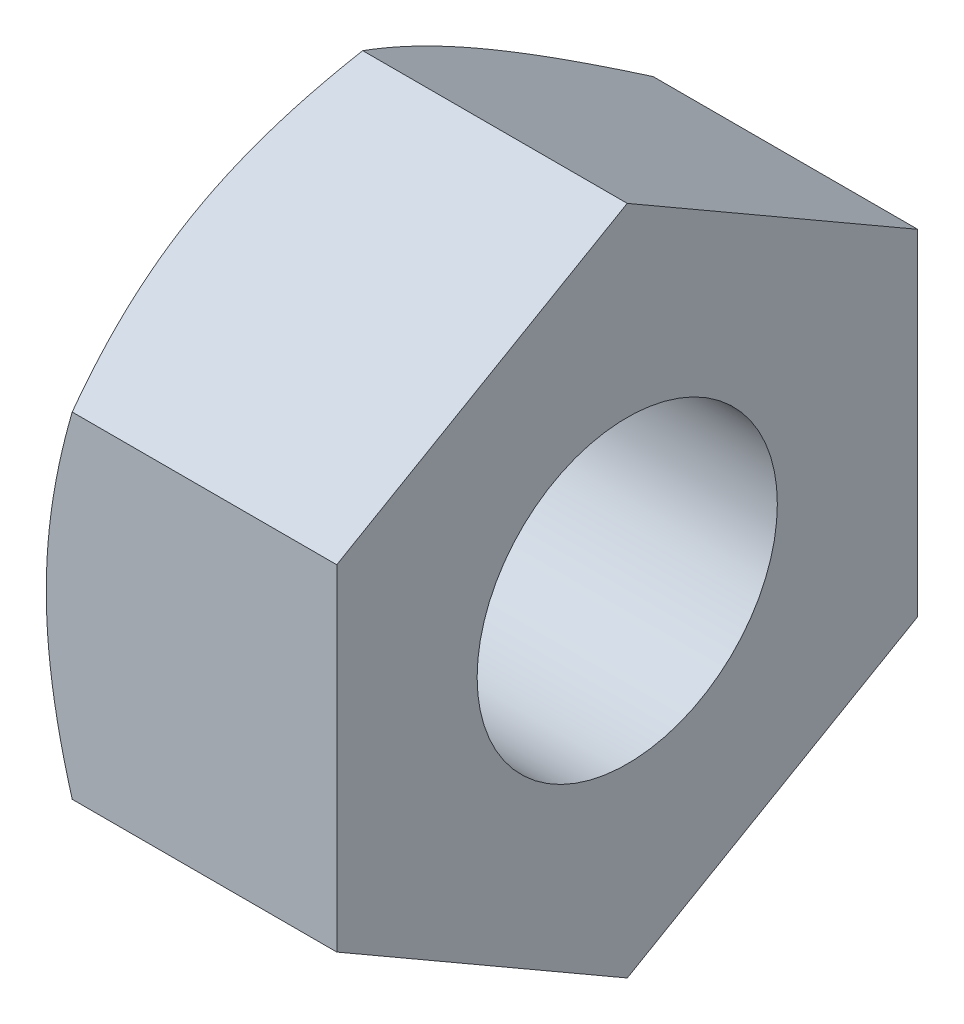
ISO-10303-21;
HEADER;
FILE_DESCRIPTION(('STEP AP214'),'2;1');
FILE_NAME('part.step','',(''),(''),'','','');
FILE_SCHEMA(('AUTOMOTIVE_DESIGN { 1 0 10303 214 1 1 1 1 }'));
ENDSEC;
DATA;
#1=APPLICATION_CONTEXT('core data for automotive mechanical design processes');
#2=APPLICATION_PROTOCOL_DEFINITION('international standard','automotive_design',2000,#1);
#3=PRODUCT_CONTEXT('',#1,'mechanical');
#4=PRODUCT('Part','Part','',(#3));
#5=PRODUCT_RELATED_PRODUCT_CATEGORY('part','',(#4));
#6=PRODUCT_DEFINITION_FORMATION('','',#4);
#7=PRODUCT_DEFINITION_CONTEXT('part definition',#1,'design');
#8=PRODUCT_DEFINITION('design','',#6,#7);
#9=PRODUCT_DEFINITION_SHAPE('','',#8);
#10=(LENGTH_UNIT() NAMED_UNIT(*) SI_UNIT(.MILLI.,.METRE.));
#11=(NAMED_UNIT(*) PLANE_ANGLE_UNIT() SI_UNIT($,.RADIAN.));
#12=(NAMED_UNIT(*) SI_UNIT($,.STERADIAN.) SOLID_ANGLE_UNIT());
#13=UNCERTAINTY_MEASURE_WITH_UNIT(LENGTH_MEASURE(1.E-05),#10,'distance_accuracy_value','');
#14=(GEOMETRIC_REPRESENTATION_CONTEXT(3) GLOBAL_UNCERTAINTY_ASSIGNED_CONTEXT((#13)) GLOBAL_UNIT_ASSIGNED_CONTEXT((#10,
#11,#12)) REPRESENTATION_CONTEXT('',''));
#15=CARTESIAN_POINT('',(0.,0.,0.));
#16=DIRECTION('',(0.,0.,1.));
#17=DIRECTION('',(1.,0.,0.));
#18=AXIS2_PLACEMENT_3D('',#15,#16,#17);
#19=CARTESIAN_POINT('',(-4.,0.,0.));
#20=DIRECTION('',(1.,0.,0.));
#21=DIRECTION('',(0.,0.,-1.));
#22=AXIS2_PLACEMENT_3D('',#19,#20,#21);
#23=PLANE('',#22);
#24=CARTESIAN_POINT('',(-4.,0.,0.));
#25=DIRECTION('',(1.,0.,0.));
#26=DIRECTION('',(0.,0.,-1.));
#27=AXIS2_PLACEMENT_3D('',#24,#25,#26);
#28=CIRCLE('',#27,4.);
#29=CARTESIAN_POINT('',(-4.,0.,-4.));
#30=VERTEX_POINT('',#29);
#31=CARTESIAN_POINT('',(-4.,3.46410161513775,-2.));
#32=VERTEX_POINT('',#31);
#33=EDGE_CURVE('E11',#30,#32,#28,.T.);
#34=ORIENTED_EDGE('',*,*,#33,.F.);
#35=CARTESIAN_POINT('',(-4.,-3.46410161513775,-2.));
#36=VERTEX_POINT('',#35);
#37=EDGE_CURVE('E52',#36,#30,#28,.T.);
#38=ORIENTED_EDGE('',*,*,#37,.F.);
#39=CARTESIAN_POINT('',(-4.,-3.46410161513775,2.));
#40=VERTEX_POINT('',#39);
#41=EDGE_CURVE('E284',#40,#36,#28,.T.);
#42=ORIENTED_EDGE('',*,*,#41,.F.);
#43=CARTESIAN_POINT('',(-4.,0.,4.));
#44=VERTEX_POINT('',#43);
#45=EDGE_CURVE('E285',#44,#40,#28,.T.);
#46=ORIENTED_EDGE('',*,*,#45,.F.);
#47=CARTESIAN_POINT('',(-4.,0.,0.));
#48=DIRECTION('',(-1.,0.,0.));
#49=DIRECTION('',(0.,0.,1.));
#50=AXIS2_PLACEMENT_3D('',#47,#48,#49);
#51=CIRCLE('',#50,4.);
#52=CARTESIAN_POINT('',(-4.,3.46410161513776,2.));
#53=VERTEX_POINT('',#52);
#54=EDGE_CURVE('E257',#44,#53,#51,.T.);
#55=ORIENTED_EDGE('',*,*,#54,.T.);
#56=EDGE_CURVE('E57',#32,#53,#28,.T.);
#57=ORIENTED_EDGE('',*,*,#56,.F.);
#58=EDGE_LOOP('',(#34,#38,#42,#46,#55,#57));
#59=FACE_BOUND('',#58,.T.);
#60=CARTESIAN_POINT('',(-4.,0.,0.));
#61=DIRECTION('',(-1.,0.,0.));
#62=DIRECTION('',(0.,0.,1.));
#63=AXIS2_PLACEMENT_3D('',#60,#61,#62);
#64=CIRCLE('',#63,2.067);
#65=CARTESIAN_POINT('',(-4.,0.,2.067));
#66=VERTEX_POINT('',#65);
#67=EDGE_CURVE('E252',#66,#66,#64,.T.);
#68=ORIENTED_EDGE('',*,*,#67,.F.);
#69=EDGE_LOOP('',(#68));
#70=FACE_BOUND('',#69,.T.);
#71=ADVANCED_FACE('F47',(#59,#70),#23,.F.);
#72=CARTESIAN_POINT('',(-4.,2.30940107675849,-4.));
#73=DIRECTION('',(0.,0.866025403784439,-0.5));
#74=DIRECTION('',(0.,0.5,0.866025403784439));
#75=AXIS2_PLACEMENT_3D('',#72,#73,#74);
#76=PLANE('',#75);
#77=DIRECTION('',(1.,0.,0.));
#78=VECTOR('',#77,1.);
#79=CARTESIAN_POINT('',(-4.,2.30940107675849,-4.));
#80=LINE('',#79,#78);
#81=CARTESIAN_POINT('',(-3.64273441009185,2.30940107675847,-4.));
#82=VERTEX_POINT('',#81);
#83=CARTESIAN_POINT('',(0.,2.30940107675849,-4.));
#84=VERTEX_POINT('',#83);
#85=EDGE_CURVE('E151',#82,#84,#80,.T.);
#86=ORIENTED_EDGE('',*,*,#85,.F.);
#87=CARTESIAN_POINT('',(-3.64266774092524,2.30928560670465,-4.0002));
#88=CARTESIAN_POINT('',(-3.70128212635173,2.41077174646169,-3.82442084967677));
#89=CARTESIAN_POINT('',(-3.75458967853775,2.51313390883498,-3.64712438367362));
#90=CARTESIAN_POINT('',(-3.8476383292536,2.7196307247981,-3.28946140682429));
#91=CARTESIAN_POINT('',(-3.8873465109703,2.82376904741903,-3.10908854102985));
#92=CARTESIAN_POINT('',(-3.94915778471973,3.03075510011793,-2.75057818129721));
#93=CARTESIAN_POINT('',(-3.97167226847712,3.1335709837249,-2.57249584706486));
#94=CARTESIAN_POINT('',(-3.99854937685343,3.33968651028526,-2.2154932828335));
#95=CARTESIAN_POINT('',(-4.00293425857306,3.44298540411432,-2.0365743503559));
#96=CARTESIAN_POINT('',(-3.99380992706004,3.6360035252293,-1.70225715780327));
#97=CARTESIAN_POINT('',(-3.98254104601201,3.72575165335063,-1.54680884001294));
#98=CARTESIAN_POINT('',(-3.94682600920182,3.90466320392053,-1.23692494436495));
#99=CARTESIAN_POINT('',(-3.92236765428848,3.99382600759477,-1.08249043825587));
#100=CARTESIAN_POINT('',(-3.86122393508072,4.17310641015195,-0.771967672225425));
#101=CARTESIAN_POINT('',(-3.82427939634515,4.26320131938129,-0.615918711936901));
#102=CARTESIAN_POINT('',(-3.74042992745199,4.44204742827549,-0.306148164596163));
#103=CARTESIAN_POINT('',(-3.69354469778727,4.53080091904965,-0.152422609226222));
#104=CARTESIAN_POINT('',(-3.64266774092525,4.61891762357083,0.000199999999999194));
#105=B_SPLINE_CURVE_WITH_KNOTS('',3,(#87,#88,#89,#90,#91,#92,#93,#94,#95,#96,#97,#98,#99,#100,
#101,#102,#103,#104),.UNSPECIFIED.,.F.,.F.,(4,2,2,2,2,2,2,2,4),(0.,0.634047835695964,
1.26961969224543,1.88946157213121,2.50854226669296,3.04757825393385,3.58711366126903,
4.13861653143763,4.68903648037743),.UNSPECIFIED.);
#106=EDGE_CURVE('E132',#82,#32,#105,.T.);
#107=ORIENTED_EDGE('',*,*,#106,.T.);
#108=CARTESIAN_POINT('',(-3.64273441009185,4.61880215351699,0.));
#109=VERTEX_POINT('',#108);
#110=EDGE_CURVE('E64',#32,#109,#105,.T.);
#111=ORIENTED_EDGE('',*,*,#110,.T.);
#112=DIRECTION('',(1.,0.,0.));
#113=VECTOR('',#112,1.);
#114=CARTESIAN_POINT('',(-4.,4.61880215351699,0.));
#115=LINE('',#114,#113);
#116=CARTESIAN_POINT('',(0.,4.61880215351699,0.));
#117=VERTEX_POINT('',#116);
#118=EDGE_CURVE('E130',#109,#117,#115,.T.);
#119=ORIENTED_EDGE('',*,*,#118,.T.);
#120=DIRECTION('',(0.,0.5,0.866025403784439));
#121=VECTOR('',#120,1.);
#122=CARTESIAN_POINT('',(0.,2.30940107675849,-4.));
#123=LINE('',#122,#121);
#124=EDGE_CURVE('E162',#84,#117,#123,.T.);
#125=ORIENTED_EDGE('',*,*,#124,.F.);
#126=EDGE_LOOP('',(#86,#107,#111,#119,#125));
#127=FACE_BOUND('',#126,.T.);
#128=ADVANCED_FACE('F49',(#127),#76,.T.);
#129=CARTESIAN_POINT('',(-4.,-2.30940107675852,-4.));
#130=DIRECTION('',(0.,0.,-1.));
#131=DIRECTION('',(-1.,0.,0.));
#132=AXIS2_PLACEMENT_3D('',#129,#130,#131);
#133=PLANE('',#132);
#134=DIRECTION('',(1.,0.,0.));
#135=VECTOR('',#134,1.);
#136=CARTESIAN_POINT('',(-4.,-2.30940107675852,-4.));
#137=LINE('',#136,#135);
#138=CARTESIAN_POINT('',(-3.64273441009185,-2.30940107675855,-3.99999999999996));
#139=VERTEX_POINT('',#138);
#140=CARTESIAN_POINT('',(0.,-2.30940107675852,-4.));
#141=VERTEX_POINT('',#140);
#142=EDGE_CURVE('E149',#139,#141,#137,.T.);
#143=ORIENTED_EDGE('',*,*,#142,.F.);
#144=CARTESIAN_POINT('',(-2.08589317875938,-6.12487198995894,-4.));
#145=CARTESIAN_POINT('',(-2.17076372923312,-5.94924937038678,-4.));
#146=CARTESIAN_POINT('',(-2.25479059619262,-5.77321152095287,-4.));
#147=CARTESIAN_POINT('',(-2.42067485320286,-5.42008084777956,-4.));
#148=CARTESIAN_POINT('',(-2.50253186763279,-5.24298784779929,-4.));
#149=CARTESIAN_POINT('',(-2.66402553694146,-4.88656571686335,-4.));
#150=CARTESIAN_POINT('',(-2.74364680493698,-4.70722958889363,-4.));
#151=CARTESIAN_POINT('',(-2.89946941457972,-4.34708334747264,-4.));
#152=CARTESIAN_POINT('',(-2.97567093449199,-4.16627331143539,-4.));
#153=CARTESIAN_POINT('',(-3.12464934960565,-3.80064706744979,-4.));
#154=CARTESIAN_POINT('',(-3.19737271578416,-3.61580892822771,-4.));
#155=CARTESIAN_POINT('',(-3.33712376904059,-3.2439524679497,-4.));
#156=CARTESIAN_POINT('',(-3.4041508224335,-3.05693390695802,-4.));
#157=CARTESIAN_POINT('',(-3.53070825156912,-2.68080318253772,-4.));
#158=CARTESIAN_POINT('',(-3.59025456521617,-2.4916964371285,-4.));
#159=CARTESIAN_POINT('',(-3.6999166434555,-2.11079454635852,-4.));
#160=CARTESIAN_POINT('',(-3.75003539032325,-1.9190002718575,-4.));
#161=CARTESIAN_POINT('',(-3.83840920504596,-1.53259232698201,-4.));
#162=CARTESIAN_POINT('',(-3.87666111404346,-1.33797792031651,-4.));
#163=CARTESIAN_POINT('',(-3.93872576407766,-0.94640272587257,-4.));
#164=CARTESIAN_POINT('',(-3.9625384923483,-0.74944193601979,-4.));
#165=CARTESIAN_POINT('',(-3.99361818685056,-0.355451989627959,-4.));
#166=CARTESIAN_POINT('',(-4.00098990076104,-0.158431311094028,-4.));
#167=CARTESIAN_POINT('',(-3.99879593362521,0.235472085607451,-4.));
#168=CARTESIAN_POINT('',(-3.98923464918465,0.432354826312188,-4.));
#169=CARTESIAN_POINT('',(-3.95912126538641,0.768560635225502,-4.));
#170=CARTESIAN_POINT('',(-3.94249070395609,0.908254618381807,-4.));
#171=CARTESIAN_POINT('',(-3.90178658965331,1.18656349063496,-4.));
#172=CARTESIAN_POINT('',(-3.87771186294156,1.32517820601013,-4.));
#173=CARTESIAN_POINT('',(-3.79558492904977,1.73929045452969,-4.));
#174=CARTESIAN_POINT('',(-3.72765111357485,2.01284690528723,-4.));
#175=CARTESIAN_POINT('',(-3.6104836406828,2.42218253014525,-4.));
#176=CARTESIAN_POINT('',(-3.56828605818837,2.5600953636154,-4.));
#177=CARTESIAN_POINT('',(-3.47971541977224,2.83448159101406,-4.));
#178=CARTESIAN_POINT('',(-3.43334524381309,2.9709559062356,-4.));
#179=CARTESIAN_POINT('',(-3.33739430081971,3.24189440516344,-4.));
#180=CARTESIAN_POINT('',(-3.2878330742465,3.37636557946841,-4.));
#181=CARTESIAN_POINT('',(-3.1858016462093,3.64426461152917,-4.));
#182=CARTESIAN_POINT('',(-3.13333026903663,3.77769202239391,-4.));
#183=CARTESIAN_POINT('',(-3.07969099345821,3.91063698986688,-4.));
#184=B_SPLINE_CURVE_WITH_KNOTS('',3,(#144,#145,#146,#147,#148,#149,#150,#151,#152,#153,#154,
#155,#156,#157,#158,#159,#160,#161,#162,#163,#164,#165,#166,#167,#168,#169,#170,#171,#172,#173,
#174,#175,#176,#177,#178,#179,#180,#181,#182,#183),.UNSPECIFIED.,.F.,.F.,(4,2,2,2,2,2,2,2,2,2,2,
2,2,2,2,2,2,2,2,4),(0.,0.585171792532271,1.17044423059927,1.7590659464599,2.34765694284827,
2.94347400997483,3.53935727210689,4.133948646976,4.7283516139147,5.32291267067844,
5.91747425310812,6.50823685854036,7.09884609659885,7.52068140825521,7.9425832713084,
8.78701491359831,9.21965281897692,9.651994371163,10.0819024146297,10.5119854255247),.UNSPECIFIED.);
#185=EDGE_CURVE('E271',#139,#30,#184,.T.);
#186=ORIENTED_EDGE('',*,*,#185,.T.);
#187=EDGE_CURVE('E175',#30,#82,#184,.T.);
#188=ORIENTED_EDGE('',*,*,#187,.T.);
#189=ORIENTED_EDGE('',*,*,#85,.T.);
#190=DIRECTION('',(0.,1.,0.));
#191=VECTOR('',#190,1.);
#192=CARTESIAN_POINT('',(0.,-2.30940107675852,-4.));
#193=LINE('',#192,#191);
#194=EDGE_CURVE('E139',#141,#84,#193,.T.);
#195=ORIENTED_EDGE('',*,*,#194,.F.);
#196=EDGE_LOOP('',(#143,#186,#188,#189,#195));
#197=FACE_BOUND('',#196,.T.);
#198=ADVANCED_FACE('F245',(#197),#133,.T.);
#199=CARTESIAN_POINT('',(-4.,-4.61880215351703,0.));
#200=DIRECTION('',(0.,-0.866025403784439,-0.5));
#201=DIRECTION('',(0.,0.5,-0.866025403784439));
#202=AXIS2_PLACEMENT_3D('',#199,#200,#201);
#203=PLANE('',#202);
#204=DIRECTION('',(1.,0.,0.));
#205=VECTOR('',#204,1.);
#206=CARTESIAN_POINT('',(-4.,-4.61880215351703,0.));
#207=LINE('',#206,#205);
#208=CARTESIAN_POINT('',(-3.64273441009185,-4.61880215351699,0.));
#209=VERTEX_POINT('',#208);
#210=CARTESIAN_POINT('',(0.,-4.61880215351703,0.));
#211=VERTEX_POINT('',#210);
#212=EDGE_CURVE('E147',#209,#211,#207,.T.);
#213=ORIENTED_EDGE('',*,*,#212,.F.);
#214=CARTESIAN_POINT('',(-3.64266774092523,-4.61891762357086,0.00020000000000064));
#215=CARTESIAN_POINT('',(-3.70128212635171,-4.51743148381382,-0.175579150323228));
#216=CARTESIAN_POINT('',(-3.75458967853773,-4.41506932144053,-0.352875616326382));
#217=CARTESIAN_POINT('',(-3.84763832925359,-4.20857250547741,-0.710538593175708));
#218=CARTESIAN_POINT('',(-3.88734651097029,-4.10443418285648,-0.890911458970153));
#219=CARTESIAN_POINT('',(-3.94915778471971,-3.89744813015758,-1.24942181870279));
#220=CARTESIAN_POINT('',(-3.9716722684771,-3.79463224655061,-1.42750415293515));
#221=CARTESIAN_POINT('',(-3.99854937685341,-3.58851671999024,-1.78450671716651));
#222=CARTESIAN_POINT('',(-4.00293425857305,-3.48521782616119,-1.96342564964411));
#223=CARTESIAN_POINT('',(-3.99380992706002,-3.2921997050462,-2.29774284219674));
#224=CARTESIAN_POINT('',(-3.982541046012,-3.20245157692488,-2.45319115998707));
#225=CARTESIAN_POINT('',(-3.9468260092018,-3.02354002635498,-2.76307505563506));
#226=CARTESIAN_POINT('',(-3.92236765428846,-2.93437722268074,-2.91750956174413));
#227=CARTESIAN_POINT('',(-3.86122393508071,-2.75509682012356,-3.22803232777458));
#228=CARTESIAN_POINT('',(-3.82427939634513,-2.66500191089422,-3.3840812880631));
#229=CARTESIAN_POINT('',(-3.74042992745197,-2.48615580200003,-3.69385183540384));
#230=CARTESIAN_POINT('',(-3.69354469778726,-2.39740231122587,-3.84757739077378));
#231=CARTESIAN_POINT('',(-3.64266774092523,-2.30928560670469,-4.0002));
#232=B_SPLINE_CURVE_WITH_KNOTS('',3,(#214,#215,#216,#217,#218,#219,#220,#221,#222,#223,#224,
#225,#226,#227,#228,#229,#230,#231),.UNSPECIFIED.,.F.,.F.,(4,2,2,2,2,2,2,2,4),(0.,
0.634047835695968,1.26961969224544,1.88946157213123,2.50854226669298,3.04757825393386,
3.58711366126904,4.13861653143764,4.68903648037743),.UNSPECIFIED.);
#233=EDGE_CURVE('E164',#209,#36,#232,.T.);
#234=ORIENTED_EDGE('',*,*,#233,.T.);
#235=EDGE_CURVE('E165',#36,#139,#232,.T.);
#236=ORIENTED_EDGE('',*,*,#235,.T.);
#237=ORIENTED_EDGE('',*,*,#142,.T.);
#238=DIRECTION('',(0.,0.5,-0.866025403784439));
#239=VECTOR('',#238,1.);
#240=CARTESIAN_POINT('',(0.,-4.61880215351703,0.));
#241=LINE('',#240,#239);
#242=EDGE_CURVE('E143',#211,#141,#241,.T.);
#243=ORIENTED_EDGE('',*,*,#242,.F.);
#244=EDGE_LOOP('',(#213,#234,#236,#237,#243));
#245=FACE_BOUND('',#244,.T.);
#246=ADVANCED_FACE('F182',(#245),#203,.T.);
#247=CARTESIAN_POINT('',(-4.,-2.30940107675852,4.));
#248=DIRECTION('',(0.,-0.866025403784439,0.5));
#249=DIRECTION('',(0.,-0.5,-0.866025403784438));
#250=AXIS2_PLACEMENT_3D('',#247,#248,#249);
#251=PLANE('',#250);
#252=DIRECTION('',(1.,0.,0.));
#253=VECTOR('',#252,1.);
#254=CARTESIAN_POINT('',(-4.,-2.30940107675852,4.));
#255=LINE('',#254,#253);
#256=CARTESIAN_POINT('',(-3.64273441009185,-2.30940107675847,4.));
#257=VERTEX_POINT('',#256);
#258=CARTESIAN_POINT('',(0.,-2.30940107675852,4.));
#259=VERTEX_POINT('',#258);
#260=EDGE_CURVE('E140',#257,#259,#255,.T.);
#261=ORIENTED_EDGE('',*,*,#260,.F.);
#262=CARTESIAN_POINT('',(-3.64266774092523,-2.30928560670468,4.0002));
#263=CARTESIAN_POINT('',(-3.70128212635172,-2.41077174646172,3.82442084967677));
#264=CARTESIAN_POINT('',(-3.75458967853774,-2.51313390883501,3.64712438367362));
#265=CARTESIAN_POINT('',(-3.84763832925359,-2.71963072479813,3.28946140682429));
#266=CARTESIAN_POINT('',(-3.88734651097029,-2.82376904741906,3.10908854102985));
#267=CARTESIAN_POINT('',(-3.94915778471971,-3.03075510011797,2.75057818129721));
#268=CARTESIAN_POINT('',(-3.9716722684771,-3.13357098372494,2.57249584706486));
#269=CARTESIAN_POINT('',(-3.99854937685341,-3.3396865102853,2.21549328283349));
#270=CARTESIAN_POINT('',(-4.00293425857305,-3.44298540411436,2.0365743503559));
#271=CARTESIAN_POINT('',(-3.99380992706002,-3.63600352522934,1.70225715780327));
#272=CARTESIAN_POINT('',(-3.982541046012,-3.72575165335066,1.54680884001293));
#273=CARTESIAN_POINT('',(-3.9468260092018,-3.90466320392056,1.23692494436494));
#274=CARTESIAN_POINT('',(-3.92236765428846,-3.9938260075948,1.08249043825587));
#275=CARTESIAN_POINT('',(-3.8612239350807,-4.17310641015199,0.771967672225422));
#276=CARTESIAN_POINT('',(-3.82427939634513,-4.26320131938133,0.615918711936898));
#277=CARTESIAN_POINT('',(-3.74042992745197,-4.44204742827552,0.306148164596161));
#278=CARTESIAN_POINT('',(-3.69354469778725,-4.53080091904968,0.152422609226221));
#279=CARTESIAN_POINT('',(-3.64266774092523,-4.61891762357086,-0.000199999999999433));
#280=B_SPLINE_CURVE_WITH_KNOTS('',3,(#262,#263,#264,#265,#266,#267,#268,#269,#270,#271,#272,
#273,#274,#275,#276,#277,#278,#279),.UNSPECIFIED.,.F.,.F.,(4,2,2,2,2,2,2,2,4),(0.,
0.634047835695966,1.26961969224543,1.88946157213122,2.50854226669297,3.04757825393386,
3.58711366126903,4.13861653143764,4.68903648037743),.UNSPECIFIED.);
#281=EDGE_CURVE('E214',#257,#40,#280,.T.);
#282=ORIENTED_EDGE('',*,*,#281,.T.);
#283=EDGE_CURVE('E174',#40,#209,#280,.T.);
#284=ORIENTED_EDGE('',*,*,#283,.T.);
#285=ORIENTED_EDGE('',*,*,#212,.T.);
#286=DIRECTION('',(0.,-0.5,-0.866025403784438));
#287=VECTOR('',#286,1.);
#288=CARTESIAN_POINT('',(0.,-2.30940107675852,4.));
#289=LINE('',#288,#287);
#290=EDGE_CURVE('E155',#259,#211,#289,.T.);
#291=ORIENTED_EDGE('',*,*,#290,.F.);
#292=EDGE_LOOP('',(#261,#282,#284,#285,#291));
#293=FACE_BOUND('',#292,.T.);
#294=ADVANCED_FACE('F221',(#293),#251,.T.);
#295=CARTESIAN_POINT('',(-4.,2.30940107675849,4.));
#296=DIRECTION('',(0.,0.,1.));
#297=DIRECTION('',(1.,0.,0.));
#298=AXIS2_PLACEMENT_3D('',#295,#296,#297);
#299=PLANE('',#298);
#300=DIRECTION('',(1.,0.,0.));
#301=VECTOR('',#300,1.);
#302=CARTESIAN_POINT('',(-4.,2.30940107675849,4.));
#303=LINE('',#302,#301);
#304=CARTESIAN_POINT('',(-3.64273441009185,2.30940107675849,4.));
#305=VERTEX_POINT('',#304);
#306=CARTESIAN_POINT('',(0.,2.30940107675849,4.));
#307=VERTEX_POINT('',#306);
#308=EDGE_CURVE('E138',#305,#307,#303,.T.);
#309=ORIENTED_EDGE('',*,*,#308,.F.);
#310=CARTESIAN_POINT('',(-2.08589317875938,-6.12487198995894,4.));
#311=CARTESIAN_POINT('',(-2.17076372923312,-5.94924937038678,4.));
#312=CARTESIAN_POINT('',(-2.25479059619262,-5.77321152095287,4.));
#313=CARTESIAN_POINT('',(-2.42067485320286,-5.42008084777956,4.));
#314=CARTESIAN_POINT('',(-2.50253186763279,-5.24298784779929,4.));
#315=CARTESIAN_POINT('',(-2.66402553694146,-4.88656571686335,4.));
#316=CARTESIAN_POINT('',(-2.74364680493698,-4.70722958889363,4.));
#317=CARTESIAN_POINT('',(-2.89946941457972,-4.34708334747264,4.));
#318=CARTESIAN_POINT('',(-2.97567093449199,-4.16627331143539,4.));
#319=CARTESIAN_POINT('',(-3.12464934960565,-3.80064706744979,4.));
#320=CARTESIAN_POINT('',(-3.19737271578416,-3.61580892822771,4.));
#321=CARTESIAN_POINT('',(-3.33712376904059,-3.24395246794969,4.));
#322=CARTESIAN_POINT('',(-3.4041508224335,-3.05693390695802,4.));
#323=CARTESIAN_POINT('',(-3.53070825156912,-2.68080318253772,4.));
#324=CARTESIAN_POINT('',(-3.59025456521617,-2.4916964371285,4.));
#325=CARTESIAN_POINT('',(-3.6999166434555,-2.11079454635852,4.));
#326=CARTESIAN_POINT('',(-3.75003539032325,-1.9190002718575,4.));
#327=CARTESIAN_POINT('',(-3.83840920504596,-1.53259232698201,4.));
#328=CARTESIAN_POINT('',(-3.87666111404346,-1.33797792031651,4.));
#329=CARTESIAN_POINT('',(-3.93872576407766,-0.946402725872566,4.));
#330=CARTESIAN_POINT('',(-3.9625384923483,-0.749441936019787,4.));
#331=CARTESIAN_POINT('',(-3.99361818685056,-0.355451989627956,4.));
#332=CARTESIAN_POINT('',(-4.00098990076104,-0.158431311094025,4.));
#333=CARTESIAN_POINT('',(-3.9987959336252,0.235472085607454,4.));
#334=CARTESIAN_POINT('',(-3.98923464918465,0.43235482631219,4.));
#335=CARTESIAN_POINT('',(-3.95912126538641,0.768560635225504,4.));
#336=CARTESIAN_POINT('',(-3.94249070395609,0.908254618381809,4.));
#337=CARTESIAN_POINT('',(-3.90178658965331,1.18656349063497,4.));
#338=CARTESIAN_POINT('',(-3.87771186294156,1.32517820601013,4.));
#339=CARTESIAN_POINT('',(-3.79558492904977,1.7392904545297,4.));
#340=CARTESIAN_POINT('',(-3.72765111357485,2.01284690528723,4.));
#341=CARTESIAN_POINT('',(-3.6104836406828,2.42218253014525,4.));
#342=CARTESIAN_POINT('',(-3.56828605818836,2.5600953636154,4.));
#343=CARTESIAN_POINT('',(-3.47971541977224,2.83448159101406,4.));
#344=CARTESIAN_POINT('',(-3.43334524381309,2.9709559062356,4.));
#345=CARTESIAN_POINT('',(-3.33739430081971,3.24189440516344,4.));
#346=CARTESIAN_POINT('',(-3.2878330742465,3.37636557946842,4.));
#347=CARTESIAN_POINT('',(-3.1858016462093,3.64426461152918,4.));
#348=CARTESIAN_POINT('',(-3.13333026903663,3.77769202239391,4.));
#349=CARTESIAN_POINT('',(-3.0796909934582,3.91063698986689,4.));
#350=B_SPLINE_CURVE_WITH_KNOTS('',3,(#310,#311,#312,#313,#314,#315,#316,#317,#318,#319,#320,
#321,#322,#323,#324,#325,#326,#327,#328,#329,#330,#331,#332,#333,#334,#335,#336,#337,#338,#339,
#340,#341,#342,#343,#344,#345,#346,#347,#348,#349),.UNSPECIFIED.,.F.,.F.,(4,2,2,2,2,2,2,2,2,2,2,
2,2,2,2,2,2,2,2,4),(0.,0.58517179253227,1.17044423059927,1.75906594645989,2.34765694284826,
2.94347400997483,3.53935727210689,4.133948646976,4.7283516139147,5.32291267067844,
5.91747425310812,6.50823685854036,7.09884609659885,7.52068140825521,7.9425832713084,
8.78701491359831,9.21965281897692,9.65199437116301,10.0819024146297,10.5119854255247),.UNSPECIFIED.);
#351=EDGE_CURVE('E124',#305,#44,#350,.F.);
#352=ORIENTED_EDGE('',*,*,#351,.T.);
#353=EDGE_CURVE('E220',#44,#257,#350,.F.);
#354=ORIENTED_EDGE('',*,*,#353,.T.);
#355=ORIENTED_EDGE('',*,*,#260,.T.);
#356=DIRECTION('',(0.,-1.,0.));
#357=VECTOR('',#356,1.);
#358=CARTESIAN_POINT('',(0.,2.30940107675849,4.));
#359=LINE('',#358,#357);
#360=EDGE_CURVE('E158',#307,#259,#359,.T.);
#361=ORIENTED_EDGE('',*,*,#360,.F.);
#362=EDGE_LOOP('',(#309,#352,#354,#355,#361));
#363=FACE_BOUND('',#362,.T.);
#364=ADVANCED_FACE('F224',(#363),#299,.T.);
#365=CARTESIAN_POINT('',(-4.,4.61880215351699,0.));
#366=DIRECTION('',(0.,0.866025403784439,0.5));
#367=DIRECTION('',(0.,-0.5,0.866025403784439));
#368=AXIS2_PLACEMENT_3D('',#365,#366,#367);
#369=PLANE('',#368);
#370=ORIENTED_EDGE('',*,*,#118,.F.);
#371=CARTESIAN_POINT('',(-3.64266774092525,4.61891762357083,-0.000200000000000455));
#372=CARTESIAN_POINT('',(-3.70128212635173,4.51743148381379,0.175579150323227));
#373=CARTESIAN_POINT('',(-3.75458967853775,4.4150693214405,0.352875616326379));
#374=CARTESIAN_POINT('',(-3.84763832925361,4.20857250547738,0.710538593175703));
#375=CARTESIAN_POINT('',(-3.88734651097031,4.10443418285645,0.890911458970147));
#376=CARTESIAN_POINT('',(-3.94915778471973,3.89744813015755,1.24942181870278));
#377=CARTESIAN_POINT('',(-3.97167226847712,3.79463224655058,1.42750415293514));
#378=CARTESIAN_POINT('',(-3.99854937685343,3.58851671999022,1.7845067171665));
#379=CARTESIAN_POINT('',(-4.00293425857306,3.48521782616116,1.96342564964409));
#380=CARTESIAN_POINT('',(-3.99380992706004,3.29219970504618,2.29774284219672));
#381=CARTESIAN_POINT('',(-3.98254104601201,3.20245157692485,2.45319115998706));
#382=CARTESIAN_POINT('',(-3.94682600920182,3.02354002635496,2.76307505563505));
#383=CARTESIAN_POINT('',(-3.92236765428848,2.93437722268071,2.91750956174412));
#384=CARTESIAN_POINT('',(-3.86122393508072,2.75509682012353,3.22803232777457));
#385=CARTESIAN_POINT('',(-3.82427939634515,2.66500191089419,3.3840812880631));
#386=CARTESIAN_POINT('',(-3.74042992745198,2.48615580199999,3.69385183540384));
#387=CARTESIAN_POINT('',(-3.69354469778727,2.39740231122583,3.84757739077378));
#388=CARTESIAN_POINT('',(-3.64266774092524,2.30928560670465,4.0002));
#389=B_SPLINE_CURVE_WITH_KNOTS('',3,(#371,#372,#373,#374,#375,#376,#377,#378,#379,#380,#381,
#382,#383,#384,#385,#386,#387,#388),.UNSPECIFIED.,.F.,.F.,(4,2,2,2,2,2,2,2,4),(0.,
0.634047835695963,1.26961969224543,1.88946157213121,2.50854226669296,3.04757825393385,
3.58711366126903,4.13861653143763,4.68903648037743),.UNSPECIFIED.);
#390=EDGE_CURVE('E118',#109,#53,#389,.T.);
#391=ORIENTED_EDGE('',*,*,#390,.T.);
#392=EDGE_CURVE('E71',#53,#305,#389,.T.);
#393=ORIENTED_EDGE('',*,*,#392,.T.);
#394=ORIENTED_EDGE('',*,*,#308,.T.);
#395=DIRECTION('',(0.,-0.5,0.866025403784439));
#396=VECTOR('',#395,1.);
#397=CARTESIAN_POINT('',(0.,4.61880215351699,0.));
#398=LINE('',#397,#396);
#399=EDGE_CURVE('E136',#117,#307,#398,.T.);
#400=ORIENTED_EDGE('',*,*,#399,.F.);
#401=EDGE_LOOP('',(#370,#391,#393,#394,#400));
#402=FACE_BOUND('',#401,.T.);
#403=ADVANCED_FACE('F134',(#402),#369,.T.);
#404=CARTESIAN_POINT('',(0.,0.,0.));
#405=DIRECTION('',(1.,0.,0.));
#406=DIRECTION('',(0.,0.,-1.));
#407=AXIS2_PLACEMENT_3D('',#404,#405,#406);
#408=PLANE('',#407);
#409=CARTESIAN_POINT('',(0.,0.,0.));
#410=DIRECTION('',(1.,0.,0.));
#411=DIRECTION('',(0.,0.,-1.));
#412=AXIS2_PLACEMENT_3D('',#409,#410,#411);
#413=CIRCLE('',#412,2.067);
#414=CARTESIAN_POINT('',(0.,0.,-2.067));
#415=VERTEX_POINT('',#414);
#416=EDGE_CURVE('E254',#415,#415,#413,.T.);
#417=ORIENTED_EDGE('',*,*,#416,.F.);
#418=EDGE_LOOP('',(#417));
#419=FACE_BOUND('',#418,.T.);
#420=ORIENTED_EDGE('',*,*,#124,.T.);
#421=ORIENTED_EDGE('',*,*,#399,.T.);
#422=ORIENTED_EDGE('',*,*,#360,.T.);
#423=ORIENTED_EDGE('',*,*,#290,.T.);
#424=ORIENTED_EDGE('',*,*,#242,.T.);
#425=ORIENTED_EDGE('',*,*,#194,.T.);
#426=EDGE_LOOP('',(#420,#421,#422,#423,#424,#425));
#427=FACE_BOUND('',#426,.T.);
#428=ADVANCED_FACE('F231',(#419,#427),#408,.T.);
#429=CARTESIAN_POINT('',(-4.,0.,0.));
#430=DIRECTION('',(1.,0.,0.));
#431=DIRECTION('',(0.,0.,-1.));
#432=AXIS2_PLACEMENT_3D('',#429,#430,#431);
#433=CONICAL_SURFACE('',#432,4.,1.0471975511966);
#434=ORIENTED_EDGE('',*,*,#37,.T.);
#435=ORIENTED_EDGE('',*,*,#185,.F.);
#436=ORIENTED_EDGE('',*,*,#235,.F.);
#437=EDGE_LOOP('',(#434,#435,#436));
#438=FACE_BOUND('',#437,.T.);
#439=ADVANCED_FACE('F236',(#438),#433,.T.);
#440=ORIENTED_EDGE('',*,*,#283,.F.);
#441=ORIENTED_EDGE('',*,*,#41,.T.);
#442=ORIENTED_EDGE('',*,*,#233,.F.);
#443=EDGE_LOOP('',(#440,#441,#442));
#444=FACE_BOUND('',#443,.T.);
#445=ADVANCED_FACE('F191',(#444),#433,.T.);
#446=ORIENTED_EDGE('',*,*,#353,.F.);
#447=ORIENTED_EDGE('',*,*,#45,.T.);
#448=ORIENTED_EDGE('',*,*,#281,.F.);
#449=EDGE_LOOP('',(#446,#447,#448));
#450=FACE_BOUND('',#449,.T.);
#451=ADVANCED_FACE('F190',(#450),#433,.T.);
#452=ORIENTED_EDGE('',*,*,#392,.F.);
#453=ORIENTED_EDGE('',*,*,#54,.F.);
#454=ORIENTED_EDGE('',*,*,#351,.F.);
#455=EDGE_LOOP('',(#452,#453,#454));
#456=FACE_BOUND('',#455,.T.);
#457=ADVANCED_FACE('F185',(#456),#433,.T.);
#458=ORIENTED_EDGE('',*,*,#56,.T.);
#459=ORIENTED_EDGE('',*,*,#390,.F.);
#460=ORIENTED_EDGE('',*,*,#110,.F.);
#461=EDGE_LOOP('',(#458,#459,#460));
#462=FACE_BOUND('',#461,.T.);
#463=ADVANCED_FACE('F119',(#462),#433,.T.);
#464=ORIENTED_EDGE('',*,*,#33,.T.);
#465=ORIENTED_EDGE('',*,*,#106,.F.);
#466=ORIENTED_EDGE('',*,*,#187,.F.);
#467=EDGE_LOOP('',(#464,#465,#466));
#468=FACE_BOUND('',#467,.T.);
#469=ADVANCED_FACE('F288',(#468),#433,.T.);
#470=CARTESIAN_POINT('',(-4.,0.,0.));
#471=DIRECTION('',(-1.,0.,0.));
#472=DIRECTION('',(0.,0.,1.));
#473=AXIS2_PLACEMENT_3D('',#470,#471,#472);
#474=CYLINDRICAL_SURFACE('',#473,2.067);
#475=ORIENTED_EDGE('',*,*,#67,.T.);
#476=EDGE_LOOP('',(#475));
#477=FACE_BOUND('',#476,.T.);
#478=ORIENTED_EDGE('',*,*,#416,.T.);
#479=EDGE_LOOP('',(#478));
#480=FACE_BOUND('',#479,.T.);
#481=ADVANCED_FACE('F192',(#477,#480),#474,.F.);
#482=CLOSED_SHELL('',(#71,#128,#198,#246,#294,#364,#403,#428,#439,#445,#451,#457,#463,#469,#481));
#483=MANIFOLD_SOLID_BREP('B2',#482);
#484=ADVANCED_BREP_SHAPE_REPRESENTATION('',(#18,#483),#14);
#485=SHAPE_DEFINITION_REPRESENTATION(#9,#484);
ENDSEC;
END-ISO-10303-21;
